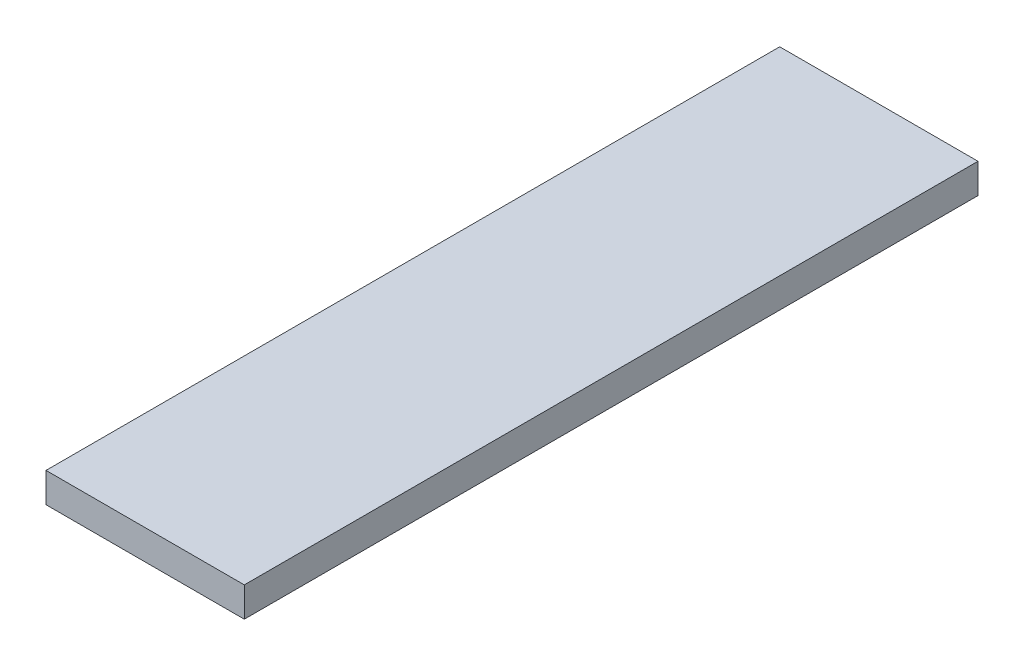
ISO-10303-21;
HEADER;
FILE_DESCRIPTION(('STEP AP214'),'2;1');
FILE_NAME('part.step','',(''),(''),'','','');
FILE_SCHEMA(('AUTOMOTIVE_DESIGN { 1 0 10303 214 1 1 1 1 }'));
ENDSEC;
DATA;
#1=APPLICATION_CONTEXT('core data for automotive mechanical design processes');
#2=APPLICATION_PROTOCOL_DEFINITION('international standard','automotive_design',2000,#1);
#3=PRODUCT_CONTEXT('',#1,'mechanical');
#4=PRODUCT('Part','Part','',(#3));
#5=PRODUCT_RELATED_PRODUCT_CATEGORY('part','',(#4));
#6=PRODUCT_DEFINITION_FORMATION('','',#4);
#7=PRODUCT_DEFINITION_CONTEXT('part definition',#1,'design');
#8=PRODUCT_DEFINITION('design','',#6,#7);
#9=PRODUCT_DEFINITION_SHAPE('','',#8);
#10=(LENGTH_UNIT() NAMED_UNIT(*) SI_UNIT(.MILLI.,.METRE.));
#11=(NAMED_UNIT(*) PLANE_ANGLE_UNIT() SI_UNIT($,.RADIAN.));
#12=(NAMED_UNIT(*) SI_UNIT($,.STERADIAN.) SOLID_ANGLE_UNIT());
#13=UNCERTAINTY_MEASURE_WITH_UNIT(LENGTH_MEASURE(1.E-05),#10,'distance_accuracy_value','');
#14=(GEOMETRIC_REPRESENTATION_CONTEXT(3) GLOBAL_UNCERTAINTY_ASSIGNED_CONTEXT((#13)) GLOBAL_UNIT_ASSIGNED_CONTEXT((#10,
#11,#12)) REPRESENTATION_CONTEXT('',''));
#15=CARTESIAN_POINT('',(0.,0.,0.));
#16=DIRECTION('',(0.,0.,1.));
#17=DIRECTION('',(1.,0.,0.));
#18=AXIS2_PLACEMENT_3D('',#15,#16,#17);
#19=CARTESIAN_POINT('',(-10.,3.,37.));
#20=DIRECTION('',(1.,0.,0.));
#21=DIRECTION('',(0.,0.,1.));
#22=AXIS2_PLACEMENT_3D('',#19,#20,#21);
#23=PLANE('',#22);
#24=DIRECTION('',(0.,1.,0.));
#25=VECTOR('',#24,1.);
#26=CARTESIAN_POINT('',(-10.,3.,-37.));
#27=LINE('',#26,#25);
#28=CARTESIAN_POINT('',(-10.,0.,-37.));
#29=VERTEX_POINT('',#28);
#30=CARTESIAN_POINT('',(-10.,3.,-37.));
#31=VERTEX_POINT('',#30);
#32=EDGE_CURVE('E11',#29,#31,#27,.T.);
#33=ORIENTED_EDGE('',*,*,#32,.F.);
#34=DIRECTION('',(0.,0.,-1.));
#35=VECTOR('',#34,1.);
#36=CARTESIAN_POINT('',(-10.,0.,0.));
#37=LINE('',#36,#35);
#38=CARTESIAN_POINT('',(-10.,0.,37.));
#39=VERTEX_POINT('',#38);
#40=EDGE_CURVE('E102',#29,#39,#37,.F.);
#41=ORIENTED_EDGE('',*,*,#40,.T.);
#42=DIRECTION('',(0.,1.,0.));
#43=VECTOR('',#42,1.);
#44=CARTESIAN_POINT('',(-10.,3.,37.));
#45=LINE('',#44,#43);
#46=CARTESIAN_POINT('',(-10.,3.,37.));
#47=VERTEX_POINT('',#46);
#48=EDGE_CURVE('E57',#39,#47,#45,.T.);
#49=ORIENTED_EDGE('',*,*,#48,.T.);
#50=DIRECTION('',(0.,0.,1.));
#51=VECTOR('',#50,1.);
#52=CARTESIAN_POINT('',(-10.,3.,37.));
#53=LINE('',#52,#51);
#54=EDGE_CURVE('E123',#31,#47,#53,.T.);
#55=ORIENTED_EDGE('',*,*,#54,.F.);
#56=EDGE_LOOP('',(#33,#41,#49,#55));
#57=FACE_BOUND('',#56,.T.);
#58=ADVANCED_FACE('F46',(#57),#23,.F.);
#59=CARTESIAN_POINT('',(-10.,3.,37.));
#60=DIRECTION('',(0.,0.,-1.));
#61=DIRECTION('',(1.,0.,0.));
#62=AXIS2_PLACEMENT_3D('',#59,#60,#61);
#63=PLANE('',#62);
#64=ORIENTED_EDGE('',*,*,#48,.F.);
#65=DIRECTION('',(1.,0.,0.));
#66=VECTOR('',#65,1.);
#67=CARTESIAN_POINT('',(0.,0.,37.));
#68=LINE('',#67,#66);
#69=CARTESIAN_POINT('',(10.,0.,37.));
#70=VERTEX_POINT('',#69);
#71=EDGE_CURVE('E112',#39,#70,#68,.T.);
#72=ORIENTED_EDGE('',*,*,#71,.T.);
#73=DIRECTION('',(0.,1.,0.));
#74=VECTOR('',#73,1.);
#75=CARTESIAN_POINT('',(10.,3.,37.));
#76=LINE('',#75,#74);
#77=CARTESIAN_POINT('',(10.,3.,37.));
#78=VERTEX_POINT('',#77);
#79=EDGE_CURVE('E65',#70,#78,#76,.T.);
#80=ORIENTED_EDGE('',*,*,#79,.T.);
#81=DIRECTION('',(1.,0.,0.));
#82=VECTOR('',#81,1.);
#83=CARTESIAN_POINT('',(-10.,3.,37.));
#84=LINE('',#83,#82);
#85=EDGE_CURVE('E96',#47,#78,#84,.T.);
#86=ORIENTED_EDGE('',*,*,#85,.F.);
#87=EDGE_LOOP('',(#64,#72,#80,#86));
#88=FACE_BOUND('',#87,.T.);
#89=ADVANCED_FACE('F128',(#88),#63,.F.);
#90=CARTESIAN_POINT('',(10.,3.,37.));
#91=DIRECTION('',(-1.,0.,0.));
#92=DIRECTION('',(0.,0.,-1.));
#93=AXIS2_PLACEMENT_3D('',#90,#91,#92);
#94=PLANE('',#93);
#95=ORIENTED_EDGE('',*,*,#79,.F.);
#96=DIRECTION('',(0.,0.,-1.));
#97=VECTOR('',#96,1.);
#98=CARTESIAN_POINT('',(10.,0.,0.));
#99=LINE('',#98,#97);
#100=CARTESIAN_POINT('',(10.,0.,-37.));
#101=VERTEX_POINT('',#100);
#102=EDGE_CURVE('E101',#70,#101,#99,.T.);
#103=ORIENTED_EDGE('',*,*,#102,.T.);
#104=DIRECTION('',(0.,1.,0.));
#105=VECTOR('',#104,1.);
#106=CARTESIAN_POINT('',(10.,3.,-37.));
#107=LINE('',#106,#105);
#108=CARTESIAN_POINT('',(10.,3.,-37.));
#109=VERTEX_POINT('',#108);
#110=EDGE_CURVE('E50',#101,#109,#107,.T.);
#111=ORIENTED_EDGE('',*,*,#110,.T.);
#112=DIRECTION('',(0.,0.,-1.));
#113=VECTOR('',#112,1.);
#114=CARTESIAN_POINT('',(10.,3.,37.));
#115=LINE('',#114,#113);
#116=EDGE_CURVE('E115',#78,#109,#115,.T.);
#117=ORIENTED_EDGE('',*,*,#116,.F.);
#118=EDGE_LOOP('',(#95,#103,#111,#117));
#119=FACE_BOUND('',#118,.T.);
#120=ADVANCED_FACE('F105',(#119),#94,.F.);
#121=CARTESIAN_POINT('',(-10.,3.,-37.));
#122=DIRECTION('',(0.,0.,1.));
#123=DIRECTION('',(-1.,0.,0.));
#124=AXIS2_PLACEMENT_3D('',#121,#122,#123);
#125=PLANE('',#124);
#126=DIRECTION('',(1.,0.,0.));
#127=VECTOR('',#126,1.);
#128=CARTESIAN_POINT('',(0.,0.,-37.));
#129=LINE('',#128,#127);
#130=EDGE_CURVE('E89',#101,#29,#129,.F.);
#131=ORIENTED_EDGE('',*,*,#130,.T.);
#132=ORIENTED_EDGE('',*,*,#32,.T.);
#133=DIRECTION('',(-1.,0.,0.));
#134=VECTOR('',#133,1.);
#135=CARTESIAN_POINT('',(-10.,3.,-37.));
#136=LINE('',#135,#134);
#137=EDGE_CURVE('E91',#109,#31,#136,.T.);
#138=ORIENTED_EDGE('',*,*,#137,.F.);
#139=ORIENTED_EDGE('',*,*,#110,.F.);
#140=EDGE_LOOP('',(#131,#132,#138,#139));
#141=FACE_BOUND('',#140,.T.);
#142=ADVANCED_FACE('F48',(#141),#125,.F.);
#143=CARTESIAN_POINT('',(0.,3.,0.));
#144=DIRECTION('',(0.,-1.,0.));
#145=DIRECTION('',(0.,0.,-1.));
#146=AXIS2_PLACEMENT_3D('',#143,#144,#145);
#147=PLANE('',#146);
#148=ORIENTED_EDGE('',*,*,#116,.T.);
#149=ORIENTED_EDGE('',*,*,#137,.T.);
#150=ORIENTED_EDGE('',*,*,#54,.T.);
#151=ORIENTED_EDGE('',*,*,#85,.T.);
#152=EDGE_LOOP('',(#148,#149,#150,#151));
#153=FACE_BOUND('',#152,.T.);
#154=ADVANCED_FACE('F126',(#153),#147,.F.);
#155=CARTESIAN_POINT('',(0.,0.,0.));
#156=DIRECTION('',(0.,-1.,0.));
#157=DIRECTION('',(0.,0.,-1.));
#158=AXIS2_PLACEMENT_3D('',#155,#156,#157);
#159=PLANE('',#158);
#160=ORIENTED_EDGE('',*,*,#102,.F.);
#161=ORIENTED_EDGE('',*,*,#71,.F.);
#162=ORIENTED_EDGE('',*,*,#40,.F.);
#163=ORIENTED_EDGE('',*,*,#130,.F.);
#164=EDGE_LOOP('',(#160,#161,#162,#163));
#165=FACE_BOUND('',#164,.T.);
#166=ADVANCED_FACE('F99',(#165),#159,.T.);
#167=CLOSED_SHELL('',(#58,#89,#120,#142,#154,#166));
#168=MANIFOLD_SOLID_BREP('B2',#167);
#169=ADVANCED_BREP_SHAPE_REPRESENTATION('',(#18,#168),#14);
#170=SHAPE_DEFINITION_REPRESENTATION(#9,#169);
ENDSEC;
END-ISO-10303-21;
